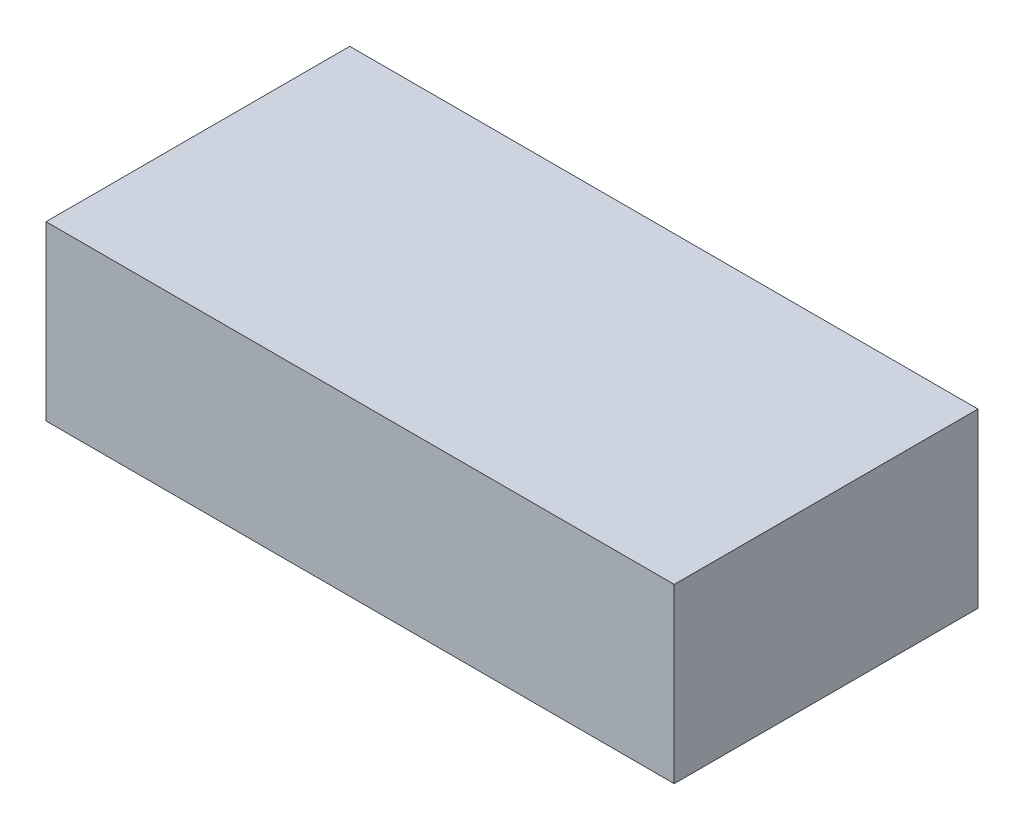
ISO-10303-21;
HEADER;
FILE_DESCRIPTION(('STEP AP214'),'2;1');
FILE_NAME('part.step','',(''),(''),'','','');
FILE_SCHEMA(('AUTOMOTIVE_DESIGN { 1 0 10303 214 1 1 1 1 }'));
ENDSEC;
DATA;
#1=APPLICATION_CONTEXT('core data for automotive mechanical design processes');
#2=APPLICATION_PROTOCOL_DEFINITION('international standard','automotive_design',2000,#1);
#3=PRODUCT_CONTEXT('',#1,'mechanical');
#4=PRODUCT('Part','Part','',(#3));
#5=PRODUCT_RELATED_PRODUCT_CATEGORY('part','',(#4));
#6=PRODUCT_DEFINITION_FORMATION('','',#4);
#7=PRODUCT_DEFINITION_CONTEXT('part definition',#1,'design');
#8=PRODUCT_DEFINITION('design','',#6,#7);
#9=PRODUCT_DEFINITION_SHAPE('','',#8);
#10=(LENGTH_UNIT() NAMED_UNIT(*) SI_UNIT(.MILLI.,.METRE.));
#11=(NAMED_UNIT(*) PLANE_ANGLE_UNIT() SI_UNIT($,.RADIAN.));
#12=(NAMED_UNIT(*) SI_UNIT($,.STERADIAN.) SOLID_ANGLE_UNIT());
#13=UNCERTAINTY_MEASURE_WITH_UNIT(LENGTH_MEASURE(1.E-05),#10,'distance_accuracy_value','');
#14=(GEOMETRIC_REPRESENTATION_CONTEXT(3) GLOBAL_UNCERTAINTY_ASSIGNED_CONTEXT((#13)) GLOBAL_UNIT_ASSIGNED_CONTEXT((#10,
#11,#12)) REPRESENTATION_CONTEXT('',''));
#15=CARTESIAN_POINT('',(0.,0.,0.));
#16=DIRECTION('',(0.,0.,1.));
#17=DIRECTION('',(1.,0.,0.));
#18=AXIS2_PLACEMENT_3D('',#15,#16,#17);
#19=CARTESIAN_POINT('',(-30.4581830768757,18.6616086868228,8.8));
#20=DIRECTION('',(1.,0.,0.));
#21=DIRECTION('',(0.,0.,-1.));
#22=AXIS2_PLACEMENT_3D('',#19,#20,#21);
#23=PLANE('',#22);
#24=DIRECTION('',(0.,-1.,0.));
#25=VECTOR('',#24,1.);
#26=CARTESIAN_POINT('',(-30.4581830768757,18.6616086868228,0.));
#27=LINE('',#26,#25);
#28=CARTESIAN_POINT('',(-30.4581830768757,18.6616086868228,0.));
#29=VERTEX_POINT('',#28);
#30=CARTESIAN_POINT('',(-30.4581830768757,13.6616086868228,0.));
#31=VERTEX_POINT('',#30);
#32=EDGE_CURVE('E98',#29,#31,#27,.T.);
#33=ORIENTED_EDGE('',*,*,#32,.T.);
#34=DIRECTION('',(0.,0.,-1.));
#35=VECTOR('',#34,1.);
#36=CARTESIAN_POINT('',(-30.4581830768757,13.6616086868228,8.8));
#37=LINE('',#36,#35);
#38=CARTESIAN_POINT('',(-30.4581830768757,13.6616086868228,8.8));
#39=VERTEX_POINT('',#38);
#40=EDGE_CURVE('E11',#39,#31,#37,.T.);
#41=ORIENTED_EDGE('',*,*,#40,.F.);
#42=DIRECTION('',(0.,-1.,0.));
#43=VECTOR('',#42,1.);
#44=CARTESIAN_POINT('',(-30.4581830768757,18.6616086868228,8.8));
#45=LINE('',#44,#43);
#46=CARTESIAN_POINT('',(-30.4581830768757,18.6616086868228,8.8));
#47=VERTEX_POINT('',#46);
#48=EDGE_CURVE('E86',#47,#39,#45,.T.);
#49=ORIENTED_EDGE('',*,*,#48,.F.);
#50=DIRECTION('',(0.,0.,-1.));
#51=VECTOR('',#50,1.);
#52=CARTESIAN_POINT('',(-30.4581830768757,18.6616086868228,8.8));
#53=LINE('',#52,#51);
#54=EDGE_CURVE('E94',#47,#29,#53,.T.);
#55=ORIENTED_EDGE('',*,*,#54,.T.);
#56=EDGE_LOOP('',(#33,#41,#49,#55));
#57=FACE_BOUND('',#56,.T.);
#58=ADVANCED_FACE('F35',(#57),#23,.F.);
#59=CARTESIAN_POINT('',(-30.4581830768757,13.6616086868228,8.8));
#60=DIRECTION('',(0.,1.,0.));
#61=DIRECTION('',(0.,0.,1.));
#62=AXIS2_PLACEMENT_3D('',#59,#60,#61);
#63=PLANE('',#62);
#64=DIRECTION('',(1.,0.,0.));
#65=VECTOR('',#64,1.);
#66=CARTESIAN_POINT('',(-30.4581830768757,13.6616086868228,0.));
#67=LINE('',#66,#65);
#68=CARTESIAN_POINT('',(-12.2581830768757,13.6616086868228,0.));
#69=VERTEX_POINT('',#68);
#70=EDGE_CURVE('E90',#31,#69,#67,.T.);
#71=ORIENTED_EDGE('',*,*,#70,.T.);
#72=DIRECTION('',(0.,0.,-1.));
#73=VECTOR('',#72,1.);
#74=CARTESIAN_POINT('',(-12.2581830768757,13.6616086868228,8.8));
#75=LINE('',#74,#73);
#76=CARTESIAN_POINT('',(-12.2581830768757,13.6616086868228,8.8));
#77=VERTEX_POINT('',#76);
#78=EDGE_CURVE('E43',#77,#69,#75,.T.);
#79=ORIENTED_EDGE('',*,*,#78,.F.);
#80=DIRECTION('',(1.,0.,0.));
#81=VECTOR('',#80,1.);
#82=CARTESIAN_POINT('',(-30.4581830768757,13.6616086868228,8.8));
#83=LINE('',#82,#81);
#84=EDGE_CURVE('E81',#39,#77,#83,.T.);
#85=ORIENTED_EDGE('',*,*,#84,.F.);
#86=ORIENTED_EDGE('',*,*,#40,.T.);
#87=EDGE_LOOP('',(#71,#79,#85,#86));
#88=FACE_BOUND('',#87,.T.);
#89=ADVANCED_FACE('F89',(#88),#63,.F.);
#90=CARTESIAN_POINT('',(-12.2581830768757,18.6616086868228,8.8));
#91=DIRECTION('',(-1.,0.,0.));
#92=DIRECTION('',(0.,-1.,0.));
#93=AXIS2_PLACEMENT_3D('',#90,#91,#92);
#94=PLANE('',#93);
#95=DIRECTION('',(0.,1.,0.));
#96=VECTOR('',#95,1.);
#97=CARTESIAN_POINT('',(-12.2581830768757,18.6616086868228,0.));
#98=LINE('',#97,#96);
#99=CARTESIAN_POINT('',(-12.2581830768757,18.6616086868228,0.));
#100=VERTEX_POINT('',#99);
#101=EDGE_CURVE('E68',#69,#100,#98,.T.);
#102=ORIENTED_EDGE('',*,*,#101,.T.);
#103=DIRECTION('',(0.,0.,-1.));
#104=VECTOR('',#103,1.);
#105=CARTESIAN_POINT('',(-12.2581830768757,18.6616086868228,8.8));
#106=LINE('',#105,#104);
#107=CARTESIAN_POINT('',(-12.2581830768757,18.6616086868228,8.8));
#108=VERTEX_POINT('',#107);
#109=EDGE_CURVE('E91',#108,#100,#106,.T.);
#110=ORIENTED_EDGE('',*,*,#109,.F.);
#111=DIRECTION('',(0.,1.,0.));
#112=VECTOR('',#111,1.);
#113=CARTESIAN_POINT('',(-12.2581830768757,18.6616086868228,8.8));
#114=LINE('',#113,#112);
#115=EDGE_CURVE('E84',#77,#108,#114,.T.);
#116=ORIENTED_EDGE('',*,*,#115,.F.);
#117=ORIENTED_EDGE('',*,*,#78,.T.);
#118=EDGE_LOOP('',(#102,#110,#116,#117));
#119=FACE_BOUND('',#118,.T.);
#120=ADVANCED_FACE('F92',(#119),#94,.F.);
#121=CARTESIAN_POINT('',(-30.4581830768757,18.6616086868228,8.8));
#122=DIRECTION('',(0.,-1.,0.));
#123=DIRECTION('',(0.,0.,-1.));
#124=AXIS2_PLACEMENT_3D('',#121,#122,#123);
#125=PLANE('',#124);
#126=DIRECTION('',(-1.,0.,0.));
#127=VECTOR('',#126,1.);
#128=CARTESIAN_POINT('',(-30.4581830768757,18.6616086868228,0.));
#129=LINE('',#128,#127);
#130=EDGE_CURVE('E74',#100,#29,#129,.T.);
#131=ORIENTED_EDGE('',*,*,#130,.T.);
#132=ORIENTED_EDGE('',*,*,#54,.F.);
#133=DIRECTION('',(-1.,0.,0.));
#134=VECTOR('',#133,1.);
#135=CARTESIAN_POINT('',(-30.4581830768757,18.6616086868228,8.8));
#136=LINE('',#135,#134);
#137=EDGE_CURVE('E51',#108,#47,#136,.T.);
#138=ORIENTED_EDGE('',*,*,#137,.F.);
#139=ORIENTED_EDGE('',*,*,#109,.T.);
#140=EDGE_LOOP('',(#131,#132,#138,#139));
#141=FACE_BOUND('',#140,.T.);
#142=ADVANCED_FACE('F105',(#141),#125,.F.);
#143=CARTESIAN_POINT('',(0.,0.,8.8));
#144=DIRECTION('',(0.,0.,1.));
#145=DIRECTION('',(1.,0.,0.));
#146=AXIS2_PLACEMENT_3D('',#143,#144,#145);
#147=PLANE('',#146);
#148=ORIENTED_EDGE('',*,*,#48,.T.);
#149=ORIENTED_EDGE('',*,*,#84,.T.);
#150=ORIENTED_EDGE('',*,*,#115,.T.);
#151=ORIENTED_EDGE('',*,*,#137,.T.);
#152=EDGE_LOOP('',(#148,#149,#150,#151));
#153=FACE_BOUND('',#152,.T.);
#154=ADVANCED_FACE('F82',(#153),#147,.T.);
#155=CARTESIAN_POINT('',(0.,0.,0.));
#156=DIRECTION('',(0.,0.,1.));
#157=DIRECTION('',(1.,0.,0.));
#158=AXIS2_PLACEMENT_3D('',#155,#156,#157);
#159=PLANE('',#158);
#160=ORIENTED_EDGE('',*,*,#32,.F.);
#161=ORIENTED_EDGE('',*,*,#130,.F.);
#162=ORIENTED_EDGE('',*,*,#101,.F.);
#163=ORIENTED_EDGE('',*,*,#70,.F.);
#164=EDGE_LOOP('',(#160,#161,#162,#163));
#165=FACE_BOUND('',#164,.T.);
#166=ADVANCED_FACE('F108',(#165),#159,.F.);
#167=CLOSED_SHELL('',(#58,#89,#120,#142,#154,#166));
#168=MANIFOLD_SOLID_BREP('B2',#167);
#169=ADVANCED_BREP_SHAPE_REPRESENTATION('',(#18,#168),#14);
#170=SHAPE_DEFINITION_REPRESENTATION(#9,#169);
ENDSEC;
END-ISO-10303-21;
